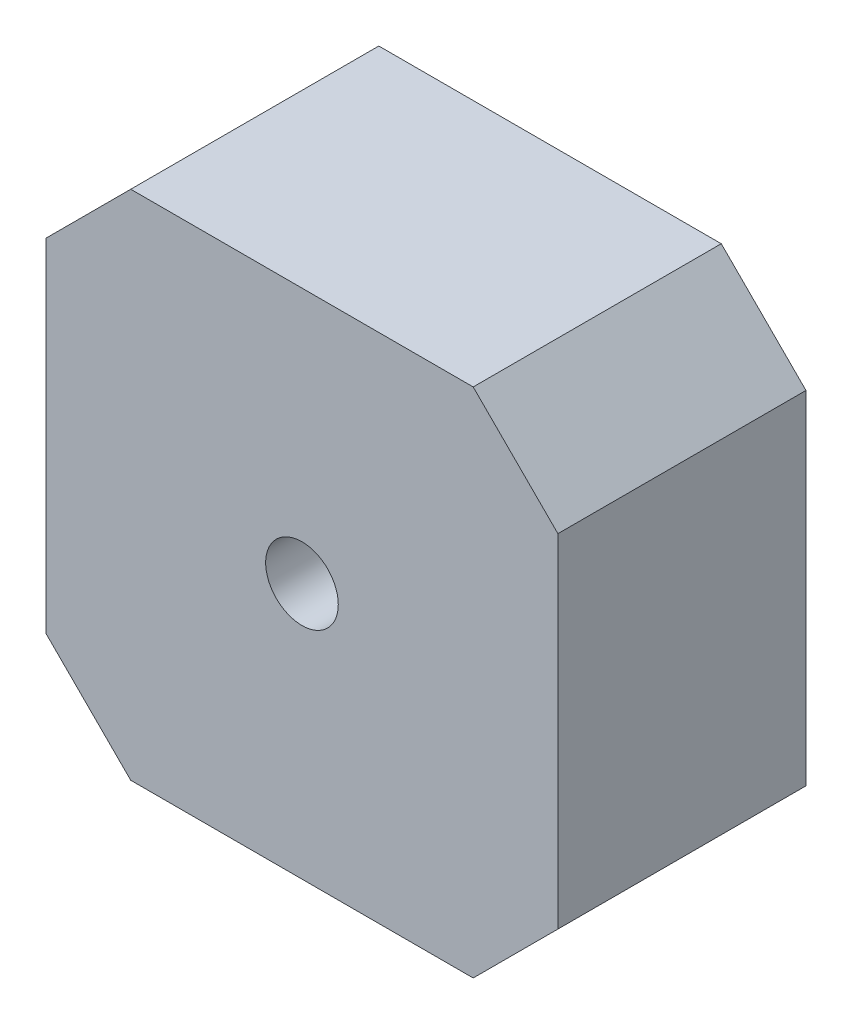
ISO-10303-21;
HEADER;
FILE_DESCRIPTION(('STEP AP214'),'2;1');
FILE_NAME('part.step','',(''),(''),'','','');
FILE_SCHEMA(('AUTOMOTIVE_DESIGN { 1 0 10303 214 1 1 1 1 }'));
ENDSEC;
DATA;
#1=APPLICATION_CONTEXT('core data for automotive mechanical design processes');
#2=APPLICATION_PROTOCOL_DEFINITION('international standard','automotive_design',2000,#1);
#3=PRODUCT_CONTEXT('',#1,'mechanical');
#4=PRODUCT('Part','Part','',(#3));
#5=PRODUCT_RELATED_PRODUCT_CATEGORY('part','',(#4));
#6=PRODUCT_DEFINITION_FORMATION('','',#4);
#7=PRODUCT_DEFINITION_CONTEXT('part definition',#1,'design');
#8=PRODUCT_DEFINITION('design','',#6,#7);
#9=PRODUCT_DEFINITION_SHAPE('','',#8);
#10=(LENGTH_UNIT() NAMED_UNIT(*) SI_UNIT(.MILLI.,.METRE.));
#11=(NAMED_UNIT(*) PLANE_ANGLE_UNIT() SI_UNIT($,.RADIAN.));
#12=(NAMED_UNIT(*) SI_UNIT($,.STERADIAN.) SOLID_ANGLE_UNIT());
#13=UNCERTAINTY_MEASURE_WITH_UNIT(LENGTH_MEASURE(1.E-05),#10,'distance_accuracy_value','');
#14=(GEOMETRIC_REPRESENTATION_CONTEXT(3) GLOBAL_UNCERTAINTY_ASSIGNED_CONTEXT((#13)) GLOBAL_UNIT_ASSIGNED_CONTEXT((#10,
#11,#12)) REPRESENTATION_CONTEXT('',''));
#15=CARTESIAN_POINT('',(0.,0.,0.));
#16=DIRECTION('',(0.,0.,1.));
#17=DIRECTION('',(1.,0.,0.));
#18=AXIS2_PLACEMENT_3D('',#15,#16,#17);
#19=CARTESIAN_POINT('',(-21.15,14.15,24.));
#20=DIRECTION('',(1.,0.,0.));
#21=DIRECTION('',(0.,0.,-1.));
#22=AXIS2_PLACEMENT_3D('',#19,#20,#21);
#23=PLANE('',#22);
#24=DIRECTION('',(0.,0.,1.));
#25=VECTOR('',#24,1.);
#26=CARTESIAN_POINT('',(-21.15,14.15,0.));
#27=LINE('',#26,#25);
#28=CARTESIAN_POINT('',(-21.15,14.15,0.));
#29=VERTEX_POINT('',#28);
#30=CARTESIAN_POINT('',(-21.15,14.15,20.5));
#31=VERTEX_POINT('',#30);
#32=EDGE_CURVE('E135',#29,#31,#27,.T.);
#33=ORIENTED_EDGE('',*,*,#32,.F.);
#34=DIRECTION('',(0.,1.,0.));
#35=VECTOR('',#34,1.);
#36=CARTESIAN_POINT('',(-21.15,-14.15,0.));
#37=LINE('',#36,#35);
#38=CARTESIAN_POINT('',(-21.15,-14.15,0.));
#39=VERTEX_POINT('',#38);
#40=EDGE_CURVE('E36',#39,#29,#37,.T.);
#41=ORIENTED_EDGE('',*,*,#40,.F.);
#42=DIRECTION('',(0.,0.,1.));
#43=VECTOR('',#42,1.);
#44=CARTESIAN_POINT('',(-21.15,-14.15,0.));
#45=LINE('',#44,#43);
#46=CARTESIAN_POINT('',(-21.15,-14.15,20.5));
#47=VERTEX_POINT('',#46);
#48=EDGE_CURVE('E11',#39,#47,#45,.T.);
#49=ORIENTED_EDGE('',*,*,#48,.T.);
#50=DIRECTION('',(0.,1.,0.));
#51=VECTOR('',#50,1.);
#52=CARTESIAN_POINT('',(-21.15,-14.15,20.5));
#53=LINE('',#52,#51);
#54=EDGE_CURVE('E27',#47,#31,#53,.T.);
#55=ORIENTED_EDGE('',*,*,#54,.T.);
#56=EDGE_LOOP('',(#33,#41,#49,#55));
#57=FACE_BOUND('',#56,.T.);
#58=ADVANCED_FACE('F17',(#57),#23,.F.);
#59=CARTESIAN_POINT('',(0.,0.,20.5));
#60=DIRECTION('',(0.,0.,1.));
#61=DIRECTION('',(1.,0.,0.));
#62=AXIS2_PLACEMENT_3D('',#59,#60,#61);
#63=PLANE('',#62);
#64=DIRECTION('',(-0.707106781186548,0.707106781186548,0.));
#65=VECTOR('',#64,1.);
#66=CARTESIAN_POINT('',(-14.15,-21.15,20.5));
#67=LINE('',#66,#65);
#68=CARTESIAN_POINT('',(-14.15,-21.15,20.5));
#69=VERTEX_POINT('',#68);
#70=EDGE_CURVE('E102',#69,#47,#67,.T.);
#71=ORIENTED_EDGE('',*,*,#70,.F.);
#72=DIRECTION('',(1.,0.,0.));
#73=VECTOR('',#72,1.);
#74=CARTESIAN_POINT('',(-14.15,-21.15,20.5));
#75=LINE('',#74,#73);
#76=CARTESIAN_POINT('',(14.15,-21.15,20.5));
#77=VERTEX_POINT('',#76);
#78=EDGE_CURVE('E101',#69,#77,#75,.T.);
#79=ORIENTED_EDGE('',*,*,#78,.T.);
#80=DIRECTION('',(-0.707106781186548,-0.707106781186548,0.));
#81=VECTOR('',#80,1.);
#82=CARTESIAN_POINT('',(21.15,-14.15,20.5));
#83=LINE('',#82,#81);
#84=CARTESIAN_POINT('',(21.15,-14.15,20.5));
#85=VERTEX_POINT('',#84);
#86=EDGE_CURVE('E113',#85,#77,#83,.T.);
#87=ORIENTED_EDGE('',*,*,#86,.F.);
#88=DIRECTION('',(0.,-1.,0.));
#89=VECTOR('',#88,1.);
#90=CARTESIAN_POINT('',(21.15,14.15,20.5));
#91=LINE('',#90,#89);
#92=CARTESIAN_POINT('',(21.15,14.15,20.5));
#93=VERTEX_POINT('',#92);
#94=EDGE_CURVE('E116',#93,#85,#91,.T.);
#95=ORIENTED_EDGE('',*,*,#94,.F.);
#96=DIRECTION('',(0.707106781186548,-0.707106781186548,0.));
#97=VECTOR('',#96,1.);
#98=CARTESIAN_POINT('',(14.15,21.15,20.5));
#99=LINE('',#98,#97);
#100=CARTESIAN_POINT('',(14.15,21.15,20.5));
#101=VERTEX_POINT('',#100);
#102=EDGE_CURVE('E125',#101,#93,#99,.T.);
#103=ORIENTED_EDGE('',*,*,#102,.F.);
#104=DIRECTION('',(1.,0.,0.));
#105=VECTOR('',#104,1.);
#106=CARTESIAN_POINT('',(-14.15,21.15,20.5));
#107=LINE('',#106,#105);
#108=CARTESIAN_POINT('',(-14.15,21.15,20.5));
#109=VERTEX_POINT('',#108);
#110=EDGE_CURVE('E130',#109,#101,#107,.T.);
#111=ORIENTED_EDGE('',*,*,#110,.F.);
#112=DIRECTION('',(0.707106781186548,0.707106781186548,0.));
#113=VECTOR('',#112,1.);
#114=CARTESIAN_POINT('',(-21.15,14.15,20.5));
#115=LINE('',#114,#113);
#116=EDGE_CURVE('E132',#31,#109,#115,.T.);
#117=ORIENTED_EDGE('',*,*,#116,.F.);
#118=ORIENTED_EDGE('',*,*,#54,.F.);
#119=EDGE_LOOP('',(#71,#79,#87,#95,#103,#111,#117,#118));
#120=FACE_BOUND('',#119,.T.);
#121=CARTESIAN_POINT('',(0.,0.,20.5));
#122=DIRECTION('',(0.,0.,-1.));
#123=DIRECTION('',(1.,0.,0.));
#124=AXIS2_PLACEMENT_3D('',#121,#122,#123);
#125=CIRCLE('',#124,3.);
#126=CARTESIAN_POINT('',(3.,0.,20.5));
#127=VERTEX_POINT('',#126);
#128=EDGE_CURVE('E137',#127,#127,#125,.T.);
#129=ORIENTED_EDGE('',*,*,#128,.T.);
#130=EDGE_LOOP('',(#129));
#131=FACE_BOUND('',#130,.T.);
#132=ADVANCED_FACE('F155',(#120,#131),#63,.T.);
#133=CARTESIAN_POINT('',(-14.15,21.15,24.));
#134=DIRECTION('',(0.707106781186548,-0.707106781186548,0.));
#135=DIRECTION('',(0.707106781186548,0.707106781186548,0.));
#136=AXIS2_PLACEMENT_3D('',#133,#134,#135);
#137=PLANE('',#136);
#138=DIRECTION('',(0.,0.,1.));
#139=VECTOR('',#138,1.);
#140=CARTESIAN_POINT('',(-14.15,21.15,0.));
#141=LINE('',#140,#139);
#142=CARTESIAN_POINT('',(-14.15,21.15,0.));
#143=VERTEX_POINT('',#142);
#144=EDGE_CURVE('E129',#143,#109,#141,.T.);
#145=ORIENTED_EDGE('',*,*,#144,.F.);
#146=DIRECTION('',(0.707106781186548,0.707106781186548,0.));
#147=VECTOR('',#146,1.);
#148=CARTESIAN_POINT('',(-21.15,14.15,0.));
#149=LINE('',#148,#147);
#150=EDGE_CURVE('E136',#29,#143,#149,.T.);
#151=ORIENTED_EDGE('',*,*,#150,.F.);
#152=ORIENTED_EDGE('',*,*,#32,.T.);
#153=ORIENTED_EDGE('',*,*,#116,.T.);
#154=EDGE_LOOP('',(#145,#151,#152,#153));
#155=FACE_BOUND('',#154,.T.);
#156=ADVANCED_FACE('F162',(#155),#137,.F.);
#157=CARTESIAN_POINT('',(0.,0.,0.));
#158=DIRECTION('',(0.,0.,1.));
#159=DIRECTION('',(1.,0.,0.));
#160=AXIS2_PLACEMENT_3D('',#157,#158,#159);
#161=PLANE('',#160);
#162=ORIENTED_EDGE('',*,*,#150,.T.);
#163=DIRECTION('',(1.,0.,0.));
#164=VECTOR('',#163,1.);
#165=CARTESIAN_POINT('',(-14.15,21.15,0.));
#166=LINE('',#165,#164);
#167=CARTESIAN_POINT('',(14.15,21.15,0.));
#168=VERTEX_POINT('',#167);
#169=EDGE_CURVE('E143',#143,#168,#166,.T.);
#170=ORIENTED_EDGE('',*,*,#169,.T.);
#171=DIRECTION('',(0.707106781186548,-0.707106781186548,0.));
#172=VECTOR('',#171,1.);
#173=CARTESIAN_POINT('',(14.15,21.15,0.));
#174=LINE('',#173,#172);
#175=CARTESIAN_POINT('',(21.15,14.15,0.));
#176=VERTEX_POINT('',#175);
#177=EDGE_CURVE('E146',#168,#176,#174,.T.);
#178=ORIENTED_EDGE('',*,*,#177,.T.);
#179=DIRECTION('',(0.,-1.,0.));
#180=VECTOR('',#179,1.);
#181=CARTESIAN_POINT('',(21.15,14.15,0.));
#182=LINE('',#181,#180);
#183=CARTESIAN_POINT('',(21.15,-14.15,0.));
#184=VERTEX_POINT('',#183);
#185=EDGE_CURVE('E149',#176,#184,#182,.T.);
#186=ORIENTED_EDGE('',*,*,#185,.T.);
#187=DIRECTION('',(-0.707106781186548,-0.707106781186548,0.));
#188=VECTOR('',#187,1.);
#189=CARTESIAN_POINT('',(21.15,-14.15,0.));
#190=LINE('',#189,#188);
#191=CARTESIAN_POINT('',(14.15,-21.15,0.));
#192=VERTEX_POINT('',#191);
#193=EDGE_CURVE('E95',#184,#192,#190,.T.);
#194=ORIENTED_EDGE('',*,*,#193,.T.);
#195=DIRECTION('',(-1.,0.,0.));
#196=VECTOR('',#195,1.);
#197=CARTESIAN_POINT('',(14.15,-21.15,0.));
#198=LINE('',#197,#196);
#199=CARTESIAN_POINT('',(-14.15,-21.15,0.));
#200=VERTEX_POINT('',#199);
#201=EDGE_CURVE('E81',#192,#200,#198,.T.);
#202=ORIENTED_EDGE('',*,*,#201,.T.);
#203=DIRECTION('',(-0.707106781186548,0.707106781186548,0.));
#204=VECTOR('',#203,1.);
#205=CARTESIAN_POINT('',(-14.15,-21.15,0.));
#206=LINE('',#205,#204);
#207=EDGE_CURVE('E87',#200,#39,#206,.T.);
#208=ORIENTED_EDGE('',*,*,#207,.T.);
#209=ORIENTED_EDGE('',*,*,#40,.T.);
#210=EDGE_LOOP('',(#162,#170,#178,#186,#194,#202,#208,#209));
#211=FACE_BOUND('',#210,.T.);
#212=CARTESIAN_POINT('',(0.,0.,0.));
#213=DIRECTION('',(0.,0.,-1.));
#214=DIRECTION('',(1.,0.,0.));
#215=AXIS2_PLACEMENT_3D('',#212,#213,#214);
#216=CIRCLE('',#215,3.);
#217=CARTESIAN_POINT('',(3.,0.,0.));
#218=VERTEX_POINT('',#217);
#219=EDGE_CURVE('E109',#218,#218,#216,.T.);
#220=ORIENTED_EDGE('',*,*,#219,.F.);
#221=EDGE_LOOP('',(#220));
#222=FACE_BOUND('',#221,.T.);
#223=ADVANCED_FACE('F92',(#211,#222),#161,.F.);
#224=CARTESIAN_POINT('',(-21.15,-14.15,24.));
#225=DIRECTION('',(0.707106781186548,0.707106781186548,0.));
#226=DIRECTION('',(-0.707106781186548,0.707106781186548,0.));
#227=AXIS2_PLACEMENT_3D('',#224,#225,#226);
#228=PLANE('',#227);
#229=ORIENTED_EDGE('',*,*,#48,.F.);
#230=ORIENTED_EDGE('',*,*,#207,.F.);
#231=DIRECTION('',(0.,0.,1.));
#232=VECTOR('',#231,1.);
#233=CARTESIAN_POINT('',(-14.15,-21.15,0.));
#234=LINE('',#233,#232);
#235=EDGE_CURVE('E90',#200,#69,#234,.T.);
#236=ORIENTED_EDGE('',*,*,#235,.T.);
#237=ORIENTED_EDGE('',*,*,#70,.T.);
#238=EDGE_LOOP('',(#229,#230,#236,#237));
#239=FACE_BOUND('',#238,.T.);
#240=ADVANCED_FACE('F88',(#239),#228,.F.);
#241=CARTESIAN_POINT('',(-14.15,-21.15,24.));
#242=DIRECTION('',(0.,1.,0.));
#243=DIRECTION('',(0.,0.,1.));
#244=AXIS2_PLACEMENT_3D('',#241,#242,#243);
#245=PLANE('',#244);
#246=ORIENTED_EDGE('',*,*,#235,.F.);
#247=ORIENTED_EDGE('',*,*,#201,.F.);
#248=DIRECTION('',(0.,0.,1.));
#249=VECTOR('',#248,1.);
#250=CARTESIAN_POINT('',(14.15,-21.15,0.));
#251=LINE('',#250,#249);
#252=EDGE_CURVE('E105',#192,#77,#251,.T.);
#253=ORIENTED_EDGE('',*,*,#252,.T.);
#254=ORIENTED_EDGE('',*,*,#78,.F.);
#255=EDGE_LOOP('',(#246,#247,#253,#254));
#256=FACE_BOUND('',#255,.T.);
#257=ADVANCED_FACE('F99',(#256),#245,.F.);
#258=CARTESIAN_POINT('',(21.15,-14.15,24.));
#259=DIRECTION('',(-0.707106781186548,0.707106781186548,0.));
#260=DIRECTION('',(-0.707106781186548,-0.707106781186548,0.));
#261=AXIS2_PLACEMENT_3D('',#258,#259,#260);
#262=PLANE('',#261);
#263=ORIENTED_EDGE('',*,*,#252,.F.);
#264=ORIENTED_EDGE('',*,*,#193,.F.);
#265=DIRECTION('',(0.,0.,1.));
#266=VECTOR('',#265,1.);
#267=CARTESIAN_POINT('',(21.15,-14.15,0.));
#268=LINE('',#267,#266);
#269=EDGE_CURVE('E111',#184,#85,#268,.T.);
#270=ORIENTED_EDGE('',*,*,#269,.T.);
#271=ORIENTED_EDGE('',*,*,#86,.T.);
#272=EDGE_LOOP('',(#263,#264,#270,#271));
#273=FACE_BOUND('',#272,.T.);
#274=ADVANCED_FACE('F153',(#273),#262,.F.);
#275=CARTESIAN_POINT('',(21.15,14.15,24.));
#276=DIRECTION('',(-1.,0.,0.));
#277=DIRECTION('',(0.,-1.,0.));
#278=AXIS2_PLACEMENT_3D('',#275,#276,#277);
#279=PLANE('',#278);
#280=ORIENTED_EDGE('',*,*,#269,.F.);
#281=ORIENTED_EDGE('',*,*,#185,.F.);
#282=DIRECTION('',(0.,0.,1.));
#283=VECTOR('',#282,1.);
#284=CARTESIAN_POINT('',(21.15,14.15,0.));
#285=LINE('',#284,#283);
#286=EDGE_CURVE('E114',#176,#93,#285,.T.);
#287=ORIENTED_EDGE('',*,*,#286,.T.);
#288=ORIENTED_EDGE('',*,*,#94,.T.);
#289=EDGE_LOOP('',(#280,#281,#287,#288));
#290=FACE_BOUND('',#289,.T.);
#291=ADVANCED_FACE('F151',(#290),#279,.F.);
#292=CARTESIAN_POINT('',(14.15,21.15,24.));
#293=DIRECTION('',(-0.707106781186548,-0.707106781186548,0.));
#294=DIRECTION('',(0.707106781186548,-0.707106781186548,0.));
#295=AXIS2_PLACEMENT_3D('',#292,#293,#294);
#296=PLANE('',#295);
#297=ORIENTED_EDGE('',*,*,#286,.F.);
#298=ORIENTED_EDGE('',*,*,#177,.F.);
#299=DIRECTION('',(0.,0.,1.));
#300=VECTOR('',#299,1.);
#301=CARTESIAN_POINT('',(14.15,21.15,0.));
#302=LINE('',#301,#300);
#303=EDGE_CURVE('E21',#168,#101,#302,.T.);
#304=ORIENTED_EDGE('',*,*,#303,.T.);
#305=ORIENTED_EDGE('',*,*,#102,.T.);
#306=EDGE_LOOP('',(#297,#298,#304,#305));
#307=FACE_BOUND('',#306,.T.);
#308=ADVANCED_FACE('F171',(#307),#296,.F.);
#309=CARTESIAN_POINT('',(-14.15,21.15,24.));
#310=DIRECTION('',(0.,-1.,0.));
#311=DIRECTION('',(0.,0.,-1.));
#312=AXIS2_PLACEMENT_3D('',#309,#310,#311);
#313=PLANE('',#312);
#314=ORIENTED_EDGE('',*,*,#303,.F.);
#315=ORIENTED_EDGE('',*,*,#169,.F.);
#316=ORIENTED_EDGE('',*,*,#144,.T.);
#317=ORIENTED_EDGE('',*,*,#110,.T.);
#318=EDGE_LOOP('',(#314,#315,#316,#317));
#319=FACE_BOUND('',#318,.T.);
#320=ADVANCED_FACE('F168',(#319),#313,.F.);
#321=CARTESIAN_POINT('',(0.,0.,20.5));
#322=DIRECTION('',(0.,0.,-1.));
#323=DIRECTION('',(-1.,0.,0.));
#324=AXIS2_PLACEMENT_3D('',#321,#322,#323);
#325=CYLINDRICAL_SURFACE('',#324,3.);
#326=ORIENTED_EDGE('',*,*,#219,.T.);
#327=EDGE_LOOP('',(#326));
#328=FACE_BOUND('',#327,.T.);
#329=ORIENTED_EDGE('',*,*,#128,.F.);
#330=EDGE_LOOP('',(#329));
#331=FACE_BOUND('',#330,.T.);
#332=ADVANCED_FACE('F19',(#328,#331),#325,.F.);
#333=CLOSED_SHELL('',(#58,#132,#156,#223,#240,#257,#274,#291,#308,#320,#332));
#334=MANIFOLD_SOLID_BREP('B1',#333);
#335=ADVANCED_BREP_SHAPE_REPRESENTATION('',(#18,#334),#14);
#336=SHAPE_DEFINITION_REPRESENTATION(#9,#335);
ENDSEC;
END-ISO-10303-21;
